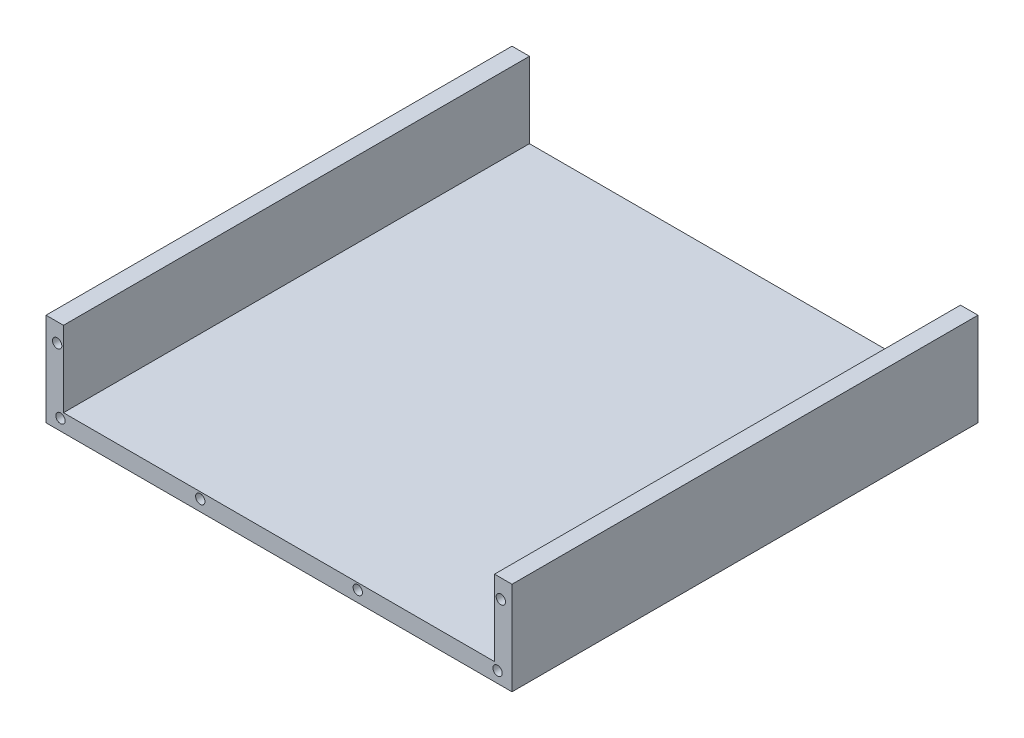
ISO-10303-21;
HEADER;
FILE_DESCRIPTION(('STEP AP214'),'2;1');
FILE_NAME('part.step','',(''),(''),'','','');
FILE_SCHEMA(('AUTOMOTIVE_DESIGN { 1 0 10303 214 1 1 1 1 }'));
ENDSEC;
DATA;
#1=APPLICATION_CONTEXT('core data for automotive mechanical design processes');
#2=APPLICATION_PROTOCOL_DEFINITION('international standard','automotive_design',2000,#1);
#3=PRODUCT_CONTEXT('',#1,'mechanical');
#4=PRODUCT('Part','Part','',(#3));
#5=PRODUCT_RELATED_PRODUCT_CATEGORY('part','',(#4));
#6=PRODUCT_DEFINITION_FORMATION('','',#4);
#7=PRODUCT_DEFINITION_CONTEXT('part definition',#1,'design');
#8=PRODUCT_DEFINITION('design','',#6,#7);
#9=PRODUCT_DEFINITION_SHAPE('','',#8);
#10=(LENGTH_UNIT() NAMED_UNIT(*) SI_UNIT(.MILLI.,.METRE.));
#11=(NAMED_UNIT(*) PLANE_ANGLE_UNIT() SI_UNIT($,.RADIAN.));
#12=(NAMED_UNIT(*) SI_UNIT($,.STERADIAN.) SOLID_ANGLE_UNIT());
#13=UNCERTAINTY_MEASURE_WITH_UNIT(LENGTH_MEASURE(1.E-05),#10,'distance_accuracy_value','');
#14=(GEOMETRIC_REPRESENTATION_CONTEXT(3) GLOBAL_UNCERTAINTY_ASSIGNED_CONTEXT((#13)) GLOBAL_UNIT_ASSIGNED_CONTEXT((#10,
#11,#12)) REPRESENTATION_CONTEXT('',''));
#15=CARTESIAN_POINT('',(0.,0.,0.));
#16=DIRECTION('',(0.,0.,1.));
#17=DIRECTION('',(1.,0.,0.));
#18=AXIS2_PLACEMENT_3D('',#15,#16,#17);
#19=CARTESIAN_POINT('',(0.,0.,63.5));
#20=DIRECTION('',(0.,0.,1.));
#21=DIRECTION('',(1.,0.,0.));
#22=AXIS2_PLACEMENT_3D('',#19,#20,#21);
#23=PLANE('',#22);
#24=CARTESIAN_POINT('',(59.563,-9.652,63.5));
#25=DIRECTION('',(0.,0.,-1.));
#26=DIRECTION('',(-1.,0.,0.));
#27=AXIS2_PLACEMENT_3D('',#24,#25,#26);
#28=CIRCLE('',#27,1.27);
#29=CARTESIAN_POINT('',(58.293,-9.652,63.5));
#30=VERTEX_POINT('',#29);
#31=EDGE_CURVE('E238',#30,#30,#28,.T.);
#32=ORIENTED_EDGE('',*,*,#31,.T.);
#33=EDGE_LOOP('',(#32));
#34=FACE_BOUND('',#33,.T.);
#35=CARTESIAN_POINT('',(-59.563,-9.652,63.5));
#36=DIRECTION('',(0.,0.,1.));
#37=DIRECTION('',(1.,0.,0.));
#38=AXIS2_PLACEMENT_3D('',#35,#36,#37);
#39=CIRCLE('',#38,1.27);
#40=CARTESIAN_POINT('',(-58.293,-9.652,63.5));
#41=VERTEX_POINT('',#40);
#42=EDGE_CURVE('E239',#41,#41,#39,.T.);
#43=ORIENTED_EDGE('',*,*,#42,.F.);
#44=EDGE_LOOP('',(#43));
#45=FACE_BOUND('',#44,.T.);
#46=CARTESIAN_POINT('',(21.463,-9.652,63.5));
#47=DIRECTION('',(0.,0.,1.));
#48=DIRECTION('',(1.,0.,0.));
#49=AXIS2_PLACEMENT_3D('',#46,#47,#48);
#50=CIRCLE('',#49,1.27);
#51=CARTESIAN_POINT('',(22.733,-9.652,63.5));
#52=VERTEX_POINT('',#51);
#53=EDGE_CURVE('E226',#52,#52,#50,.T.);
#54=ORIENTED_EDGE('',*,*,#53,.F.);
#55=EDGE_LOOP('',(#54));
#56=FACE_BOUND('',#55,.T.);
#57=DIRECTION('',(-1.,0.,0.));
#58=VECTOR('',#57,1.);
#59=CARTESIAN_POINT('',(-58.7375,12.7,63.5));
#60=LINE('',#59,#58);
#61=CARTESIAN_POINT('',(-58.7375,12.7,63.5));
#62=VERTEX_POINT('',#61);
#63=CARTESIAN_POINT('',(-63.5,12.7,63.5));
#64=VERTEX_POINT('',#63);
#65=EDGE_CURVE('E180',#62,#64,#60,.T.);
#66=ORIENTED_EDGE('',*,*,#65,.T.);
#67=DIRECTION('',(0.,-1.,0.));
#68=VECTOR('',#67,1.);
#69=CARTESIAN_POINT('',(-63.5,12.7,63.5));
#70=LINE('',#69,#68);
#71=CARTESIAN_POINT('',(-63.5,-12.7,63.5));
#72=VERTEX_POINT('',#71);
#73=EDGE_CURVE('E115',#64,#72,#70,.T.);
#74=ORIENTED_EDGE('',*,*,#73,.T.);
#75=DIRECTION('',(1.,0.,0.));
#76=VECTOR('',#75,1.);
#77=CARTESIAN_POINT('',(-63.5,-12.7,63.5));
#78=LINE('',#77,#76);
#79=CARTESIAN_POINT('',(63.5,-12.7,63.5));
#80=VERTEX_POINT('',#79);
#81=EDGE_CURVE('E202',#72,#80,#78,.T.);
#82=ORIENTED_EDGE('',*,*,#81,.T.);
#83=DIRECTION('',(0.,1.,0.));
#84=VECTOR('',#83,1.);
#85=CARTESIAN_POINT('',(63.5,-12.7,63.5));
#86=LINE('',#85,#84);
#87=CARTESIAN_POINT('',(63.5,12.7,63.5));
#88=VERTEX_POINT('',#87);
#89=EDGE_CURVE('E215',#80,#88,#86,.T.);
#90=ORIENTED_EDGE('',*,*,#89,.T.);
#91=DIRECTION('',(-1.,0.,0.));
#92=VECTOR('',#91,1.);
#93=CARTESIAN_POINT('',(63.5,12.7,63.5));
#94=LINE('',#93,#92);
#95=CARTESIAN_POINT('',(58.7375,12.7,63.5));
#96=VERTEX_POINT('',#95);
#97=EDGE_CURVE('E134',#88,#96,#94,.T.);
#98=ORIENTED_EDGE('',*,*,#97,.T.);
#99=DIRECTION('',(0.,-1.,0.));
#100=VECTOR('',#99,1.);
#101=CARTESIAN_POINT('',(58.7375,12.7,63.5));
#102=LINE('',#101,#100);
#103=CARTESIAN_POINT('',(58.7375,-7.93749999999999,63.5));
#104=VERTEX_POINT('',#103);
#105=EDGE_CURVE('E128',#96,#104,#102,.T.);
#106=ORIENTED_EDGE('',*,*,#105,.T.);
#107=DIRECTION('',(-1.,0.,0.));
#108=VECTOR('',#107,1.);
#109=CARTESIAN_POINT('',(58.7375,-7.93749999999999,63.5));
#110=LINE('',#109,#108);
#111=CARTESIAN_POINT('',(-58.7375,-7.9375,63.5));
#112=VERTEX_POINT('',#111);
#113=EDGE_CURVE('E132',#104,#112,#110,.T.);
#114=ORIENTED_EDGE('',*,*,#113,.T.);
#115=DIRECTION('',(0.,1.,0.));
#116=VECTOR('',#115,1.);
#117=CARTESIAN_POINT('',(-58.7375,-7.9375,63.5));
#118=LINE('',#117,#116);
#119=EDGE_CURVE('E72',#112,#62,#118,.T.);
#120=ORIENTED_EDGE('',*,*,#119,.T.);
#121=EDGE_LOOP('',(#66,#74,#82,#90,#98,#106,#114,#120));
#122=FACE_BOUND('',#121,.T.);
#123=CARTESIAN_POINT('',(-21.463,-9.652,63.5));
#124=DIRECTION('',(0.,0.,1.));
#125=DIRECTION('',(1.,0.,0.));
#126=AXIS2_PLACEMENT_3D('',#123,#124,#125);
#127=CIRCLE('',#126,1.27);
#128=CARTESIAN_POINT('',(-20.193,-9.652,63.5));
#129=VERTEX_POINT('',#128);
#130=EDGE_CURVE('E247',#129,#129,#127,.T.);
#131=ORIENTED_EDGE('',*,*,#130,.F.);
#132=EDGE_LOOP('',(#131));
#133=FACE_BOUND('',#132,.T.);
#134=CARTESIAN_POINT('',(-60.452,7.62,63.5));
#135=DIRECTION('',(0.,0.,1.));
#136=DIRECTION('',(1.,0.,0.));
#137=AXIS2_PLACEMENT_3D('',#134,#135,#136);
#138=CIRCLE('',#137,1.27);
#139=CARTESIAN_POINT('',(-59.182,7.62,63.5));
#140=VERTEX_POINT('',#139);
#141=EDGE_CURVE('E255',#140,#140,#138,.T.);
#142=ORIENTED_EDGE('',*,*,#141,.F.);
#143=EDGE_LOOP('',(#142));
#144=FACE_BOUND('',#143,.T.);
#145=CARTESIAN_POINT('',(60.452,7.62,63.5));
#146=DIRECTION('',(0.,0.,1.));
#147=DIRECTION('',(1.,0.,0.));
#148=AXIS2_PLACEMENT_3D('',#145,#146,#147);
#149=CIRCLE('',#148,1.26999999999999);
#150=CARTESIAN_POINT('',(61.722,7.62,63.5));
#151=VERTEX_POINT('',#150);
#152=EDGE_CURVE('E230',#151,#151,#149,.F.);
#153=ORIENTED_EDGE('',*,*,#152,.T.);
#154=EDGE_LOOP('',(#153));
#155=FACE_BOUND('',#154,.T.);
#156=ADVANCED_FACE('F54',(#34,#45,#56,#122,#133,#144,#155),#23,.T.);
#157=CARTESIAN_POINT('',(-58.7375,12.7,63.5));
#158=DIRECTION('',(0.,-1.,0.));
#159=DIRECTION('',(0.,0.,-1.));
#160=AXIS2_PLACEMENT_3D('',#157,#158,#159);
#161=PLANE('',#160);
#162=DIRECTION('',(-1.,0.,0.));
#163=VECTOR('',#162,1.);
#164=CARTESIAN_POINT('',(-58.7375,12.7,-63.5));
#165=LINE('',#164,#163);
#166=CARTESIAN_POINT('',(-58.7375,12.7,-63.5));
#167=VERTEX_POINT('',#166);
#168=CARTESIAN_POINT('',(-63.5,12.7,-63.5));
#169=VERTEX_POINT('',#168);
#170=EDGE_CURVE('E157',#167,#169,#165,.T.);
#171=ORIENTED_EDGE('',*,*,#170,.T.);
#172=DIRECTION('',(0.,0.,-1.));
#173=VECTOR('',#172,1.);
#174=CARTESIAN_POINT('',(-63.5,12.7,63.5));
#175=LINE('',#174,#173);
#176=EDGE_CURVE('E13',#64,#169,#175,.T.);
#177=ORIENTED_EDGE('',*,*,#176,.F.);
#178=ORIENTED_EDGE('',*,*,#65,.F.);
#179=DIRECTION('',(0.,0.,-1.));
#180=VECTOR('',#179,1.);
#181=CARTESIAN_POINT('',(-58.7375,12.7,63.5));
#182=LINE('',#181,#180);
#183=EDGE_CURVE('E153',#62,#167,#182,.T.);
#184=ORIENTED_EDGE('',*,*,#183,.T.);
#185=EDGE_LOOP('',(#171,#177,#178,#184));
#186=FACE_BOUND('',#185,.T.);
#187=ADVANCED_FACE('F56',(#186),#161,.F.);
#188=CARTESIAN_POINT('',(-63.5,12.7,63.5));
#189=DIRECTION('',(1.,0.,0.));
#190=DIRECTION('',(0.,0.,-1.));
#191=AXIS2_PLACEMENT_3D('',#188,#189,#190);
#192=PLANE('',#191);
#193=DIRECTION('',(0.,-1.,0.));
#194=VECTOR('',#193,1.);
#195=CARTESIAN_POINT('',(-63.5,12.7,-63.5));
#196=LINE('',#195,#194);
#197=CARTESIAN_POINT('',(-63.5,-12.7,-63.5));
#198=VERTEX_POINT('',#197);
#199=EDGE_CURVE('E161',#169,#198,#196,.T.);
#200=ORIENTED_EDGE('',*,*,#199,.T.);
#201=DIRECTION('',(0.,0.,-1.));
#202=VECTOR('',#201,1.);
#203=CARTESIAN_POINT('',(-63.5,-12.7,63.5));
#204=LINE('',#203,#202);
#205=EDGE_CURVE('E64',#72,#198,#204,.T.);
#206=ORIENTED_EDGE('',*,*,#205,.F.);
#207=ORIENTED_EDGE('',*,*,#73,.F.);
#208=ORIENTED_EDGE('',*,*,#176,.T.);
#209=EDGE_LOOP('',(#200,#206,#207,#208));
#210=FACE_BOUND('',#209,.T.);
#211=ADVANCED_FACE('F356',(#210),#192,.F.);
#212=CARTESIAN_POINT('',(-63.5,-12.7,63.5));
#213=DIRECTION('',(0.,1.,0.));
#214=DIRECTION('',(0.,0.,1.));
#215=AXIS2_PLACEMENT_3D('',#212,#213,#214);
#216=PLANE('',#215);
#217=DIRECTION('',(1.,0.,0.));
#218=VECTOR('',#217,1.);
#219=CARTESIAN_POINT('',(-63.5,-12.7,-63.5));
#220=LINE('',#219,#218);
#221=CARTESIAN_POINT('',(63.5,-12.7,-63.5));
#222=VERTEX_POINT('',#221);
#223=EDGE_CURVE('E165',#198,#222,#220,.T.);
#224=ORIENTED_EDGE('',*,*,#223,.T.);
#225=DIRECTION('',(0.,0.,-1.));
#226=VECTOR('',#225,1.);
#227=CARTESIAN_POINT('',(63.5,-12.7,63.5));
#228=LINE('',#227,#226);
#229=EDGE_CURVE('E191',#80,#222,#228,.T.);
#230=ORIENTED_EDGE('',*,*,#229,.F.);
#231=ORIENTED_EDGE('',*,*,#81,.F.);
#232=ORIENTED_EDGE('',*,*,#205,.T.);
#233=EDGE_LOOP('',(#224,#230,#231,#232));
#234=FACE_BOUND('',#233,.T.);
#235=ADVANCED_FACE('F200',(#234),#216,.F.);
#236=CARTESIAN_POINT('',(63.5,-12.7,63.5));
#237=DIRECTION('',(-1.,0.,0.));
#238=DIRECTION('',(0.,0.,1.));
#239=AXIS2_PLACEMENT_3D('',#236,#237,#238);
#240=PLANE('',#239);
#241=DIRECTION('',(0.,1.,0.));
#242=VECTOR('',#241,1.);
#243=CARTESIAN_POINT('',(63.5,-12.7,-63.5));
#244=LINE('',#243,#242);
#245=CARTESIAN_POINT('',(63.5,12.7,-63.5));
#246=VERTEX_POINT('',#245);
#247=EDGE_CURVE('E168',#222,#246,#244,.T.);
#248=ORIENTED_EDGE('',*,*,#247,.T.);
#249=DIRECTION('',(0.,0.,-1.));
#250=VECTOR('',#249,1.);
#251=CARTESIAN_POINT('',(63.5,12.7,63.5));
#252=LINE('',#251,#250);
#253=EDGE_CURVE('E187',#88,#246,#252,.T.);
#254=ORIENTED_EDGE('',*,*,#253,.F.);
#255=ORIENTED_EDGE('',*,*,#89,.F.);
#256=ORIENTED_EDGE('',*,*,#229,.T.);
#257=EDGE_LOOP('',(#248,#254,#255,#256));
#258=FACE_BOUND('',#257,.T.);
#259=ADVANCED_FACE('F210',(#258),#240,.F.);
#260=CARTESIAN_POINT('',(63.5,12.7,63.5));
#261=DIRECTION('',(0.,-1.,0.));
#262=DIRECTION('',(0.,0.,-1.));
#263=AXIS2_PLACEMENT_3D('',#260,#261,#262);
#264=PLANE('',#263);
#265=DIRECTION('',(-1.,0.,0.));
#266=VECTOR('',#265,1.);
#267=CARTESIAN_POINT('',(63.5,12.7,-63.5));
#268=LINE('',#267,#266);
#269=CARTESIAN_POINT('',(58.7375,12.7,-63.5));
#270=VERTEX_POINT('',#269);
#271=EDGE_CURVE('E171',#246,#270,#268,.T.);
#272=ORIENTED_EDGE('',*,*,#271,.T.);
#273=DIRECTION('',(0.,0.,-1.));
#274=VECTOR('',#273,1.);
#275=CARTESIAN_POINT('',(58.7375,12.7,63.5));
#276=LINE('',#275,#274);
#277=EDGE_CURVE('E145',#96,#270,#276,.T.);
#278=ORIENTED_EDGE('',*,*,#277,.F.);
#279=ORIENTED_EDGE('',*,*,#97,.F.);
#280=ORIENTED_EDGE('',*,*,#253,.T.);
#281=EDGE_LOOP('',(#272,#278,#279,#280));
#282=FACE_BOUND('',#281,.T.);
#283=ADVANCED_FACE('F213',(#282),#264,.F.);
#284=CARTESIAN_POINT('',(58.7375,12.7,63.5));
#285=DIRECTION('',(1.,0.,0.));
#286=DIRECTION('',(0.,0.,-1.));
#287=AXIS2_PLACEMENT_3D('',#284,#285,#286);
#288=PLANE('',#287);
#289=DIRECTION('',(0.,-1.,0.));
#290=VECTOR('',#289,1.);
#291=CARTESIAN_POINT('',(58.7375,12.7,-63.5));
#292=LINE('',#291,#290);
#293=CARTESIAN_POINT('',(58.7375,-7.93749999999999,-63.5));
#294=VERTEX_POINT('',#293);
#295=EDGE_CURVE('E143',#270,#294,#292,.T.);
#296=ORIENTED_EDGE('',*,*,#295,.T.);
#297=DIRECTION('',(0.,0.,-1.));
#298=VECTOR('',#297,1.);
#299=CARTESIAN_POINT('',(58.7375,-7.93749999999999,63.5));
#300=LINE('',#299,#298);
#301=EDGE_CURVE('E140',#104,#294,#300,.T.);
#302=ORIENTED_EDGE('',*,*,#301,.F.);
#303=ORIENTED_EDGE('',*,*,#105,.F.);
#304=ORIENTED_EDGE('',*,*,#277,.T.);
#305=EDGE_LOOP('',(#296,#302,#303,#304));
#306=FACE_BOUND('',#305,.T.);
#307=ADVANCED_FACE('F141',(#306),#288,.F.);
#308=CARTESIAN_POINT('',(58.7375,-7.93749999999999,63.5));
#309=DIRECTION('',(0.,-1.,0.));
#310=DIRECTION('',(1.,0.,0.));
#311=AXIS2_PLACEMENT_3D('',#308,#309,#310);
#312=PLANE('',#311);
#313=DIRECTION('',(-1.,0.,0.));
#314=VECTOR('',#313,1.);
#315=CARTESIAN_POINT('',(58.7375,-7.93749999999999,-63.5));
#316=LINE('',#315,#314);
#317=CARTESIAN_POINT('',(-58.7375,-7.9375,-63.5));
#318=VERTEX_POINT('',#317);
#319=EDGE_CURVE('E101',#294,#318,#316,.T.);
#320=ORIENTED_EDGE('',*,*,#319,.T.);
#321=DIRECTION('',(0.,0.,-1.));
#322=VECTOR('',#321,1.);
#323=CARTESIAN_POINT('',(-58.7375,-7.9375,63.5));
#324=LINE('',#323,#322);
#325=EDGE_CURVE('E146',#112,#318,#324,.T.);
#326=ORIENTED_EDGE('',*,*,#325,.F.);
#327=ORIENTED_EDGE('',*,*,#113,.F.);
#328=ORIENTED_EDGE('',*,*,#301,.T.);
#329=EDGE_LOOP('',(#320,#326,#327,#328));
#330=FACE_BOUND('',#329,.T.);
#331=ADVANCED_FACE('F148',(#330),#312,.F.);
#332=CARTESIAN_POINT('',(-58.7375,-7.9375,63.5));
#333=DIRECTION('',(-1.,0.,0.));
#334=DIRECTION('',(0.,0.,1.));
#335=AXIS2_PLACEMENT_3D('',#332,#333,#334);
#336=PLANE('',#335);
#337=DIRECTION('',(0.,1.,0.));
#338=VECTOR('',#337,1.);
#339=CARTESIAN_POINT('',(-58.7375,-7.9375,-63.5));
#340=LINE('',#339,#338);
#341=EDGE_CURVE('E107',#318,#167,#340,.T.);
#342=ORIENTED_EDGE('',*,*,#341,.T.);
#343=ORIENTED_EDGE('',*,*,#183,.F.);
#344=ORIENTED_EDGE('',*,*,#119,.F.);
#345=ORIENTED_EDGE('',*,*,#325,.T.);
#346=EDGE_LOOP('',(#342,#343,#344,#345));
#347=FACE_BOUND('',#346,.T.);
#348=ADVANCED_FACE('F328',(#347),#336,.F.);
#349=CARTESIAN_POINT('',(0.,0.,-63.5));
#350=DIRECTION('',(0.,0.,1.));
#351=DIRECTION('',(1.,0.,0.));
#352=AXIS2_PLACEMENT_3D('',#349,#350,#351);
#353=PLANE('',#352);
#354=CARTESIAN_POINT('',(60.452,7.61999999999999,-63.5));
#355=DIRECTION('',(0.,0.,-1.));
#356=DIRECTION('',(-1.,0.,0.));
#357=AXIS2_PLACEMENT_3D('',#354,#355,#356);
#358=CIRCLE('',#357,1.27);
#359=CARTESIAN_POINT('',(59.182,7.61999999999999,-63.5));
#360=VERTEX_POINT('',#359);
#361=EDGE_CURVE('E278',#360,#360,#358,.T.);
#362=ORIENTED_EDGE('',*,*,#361,.F.);
#363=EDGE_LOOP('',(#362));
#364=FACE_BOUND('',#363,.T.);
#365=CARTESIAN_POINT('',(21.463,-9.652,-63.5));
#366=DIRECTION('',(0.,0.,-1.));
#367=DIRECTION('',(-1.,0.,0.));
#368=AXIS2_PLACEMENT_3D('',#365,#366,#367);
#369=CIRCLE('',#368,1.27);
#370=CARTESIAN_POINT('',(20.193,-9.652,-63.5));
#371=VERTEX_POINT('',#370);
#372=EDGE_CURVE('E303',#371,#371,#369,.T.);
#373=ORIENTED_EDGE('',*,*,#372,.F.);
#374=EDGE_LOOP('',(#373));
#375=FACE_BOUND('',#374,.T.);
#376=CARTESIAN_POINT('',(-21.463,-9.652,-63.5));
#377=DIRECTION('',(0.,0.,-1.));
#378=DIRECTION('',(1.,0.,0.));
#379=AXIS2_PLACEMENT_3D('',#376,#377,#378);
#380=CIRCLE('',#379,1.27);
#381=CARTESIAN_POINT('',(-20.193,-9.652,-63.5));
#382=VERTEX_POINT('',#381);
#383=EDGE_CURVE('E295',#382,#382,#380,.T.);
#384=ORIENTED_EDGE('',*,*,#383,.F.);
#385=EDGE_LOOP('',(#384));
#386=FACE_BOUND('',#385,.T.);
#387=CARTESIAN_POINT('',(-60.452,7.61999999999999,-63.5));
#388=DIRECTION('',(0.,0.,-1.));
#389=DIRECTION('',(1.,0.,0.));
#390=AXIS2_PLACEMENT_3D('',#387,#388,#389);
#391=CIRCLE('',#390,1.27);
#392=CARTESIAN_POINT('',(-59.182,7.61999999999999,-63.5));
#393=VERTEX_POINT('',#392);
#394=EDGE_CURVE('E286',#393,#393,#391,.T.);
#395=ORIENTED_EDGE('',*,*,#394,.F.);
#396=EDGE_LOOP('',(#395));
#397=FACE_BOUND('',#396,.T.);
#398=CARTESIAN_POINT('',(-59.563,-9.652,-63.5));
#399=DIRECTION('',(0.,0.,-1.));
#400=DIRECTION('',(1.,0.,0.));
#401=AXIS2_PLACEMENT_3D('',#398,#399,#400);
#402=CIRCLE('',#401,1.27);
#403=CARTESIAN_POINT('',(-58.293,-9.652,-63.5));
#404=VERTEX_POINT('',#403);
#405=EDGE_CURVE('E287',#404,#404,#402,.T.);
#406=ORIENTED_EDGE('',*,*,#405,.F.);
#407=EDGE_LOOP('',(#406));
#408=FACE_BOUND('',#407,.T.);
#409=CARTESIAN_POINT('',(59.563,-9.652,-63.5));
#410=DIRECTION('',(0.,0.,-1.));
#411=DIRECTION('',(-1.,0.,0.));
#412=AXIS2_PLACEMENT_3D('',#409,#410,#411);
#413=CIRCLE('',#412,1.27);
#414=CARTESIAN_POINT('',(58.293,-9.652,-63.5));
#415=VERTEX_POINT('',#414);
#416=EDGE_CURVE('E274',#415,#415,#413,.T.);
#417=ORIENTED_EDGE('',*,*,#416,.F.);
#418=EDGE_LOOP('',(#417));
#419=FACE_BOUND('',#418,.T.);
#420=ORIENTED_EDGE('',*,*,#170,.F.);
#421=ORIENTED_EDGE('',*,*,#341,.F.);
#422=ORIENTED_EDGE('',*,*,#319,.F.);
#423=ORIENTED_EDGE('',*,*,#295,.F.);
#424=ORIENTED_EDGE('',*,*,#271,.F.);
#425=ORIENTED_EDGE('',*,*,#247,.F.);
#426=ORIENTED_EDGE('',*,*,#223,.F.);
#427=ORIENTED_EDGE('',*,*,#199,.F.);
#428=EDGE_LOOP('',(#420,#421,#422,#423,#424,#425,#426,#427));
#429=FACE_BOUND('',#428,.T.);
#430=ADVANCED_FACE('F206',(#364,#375,#386,#397,#408,#419,#429),#353,.F.);
#431=CARTESIAN_POINT('',(21.463,-9.652,60.96));
#432=DIRECTION('',(0.,0.,1.));
#433=DIRECTION('',(1.,0.,0.));
#434=AXIS2_PLACEMENT_3D('',#431,#432,#433);
#435=CYLINDRICAL_SURFACE('',#434,1.27);
#436=CARTESIAN_POINT('',(21.463,-9.652,60.96));
#437=DIRECTION('',(0.,0.,1.));
#438=DIRECTION('',(1.,0.,0.));
#439=AXIS2_PLACEMENT_3D('',#436,#437,#438);
#440=CIRCLE('',#439,1.27);
#441=CARTESIAN_POINT('',(22.733,-9.652,60.96));
#442=VERTEX_POINT('',#441);
#443=EDGE_CURVE('E162',#442,#442,#440,.T.);
#444=ORIENTED_EDGE('',*,*,#443,.F.);
#445=EDGE_LOOP('',(#444));
#446=FACE_BOUND('',#445,.T.);
#447=ORIENTED_EDGE('',*,*,#53,.T.);
#448=EDGE_LOOP('',(#447));
#449=FACE_BOUND('',#448,.T.);
#450=ADVANCED_FACE('F327',(#446,#449),#435,.F.);
#451=CARTESIAN_POINT('',(0.,0.,60.96));
#452=DIRECTION('',(0.,0.,1.));
#453=DIRECTION('',(1.,0.,0.));
#454=AXIS2_PLACEMENT_3D('',#451,#452,#453);
#455=PLANE('',#454);
#456=ORIENTED_EDGE('',*,*,#443,.T.);
#457=EDGE_LOOP('',(#456));
#458=FACE_BOUND('',#457,.T.);
#459=ADVANCED_FACE('F415',(#458),#455,.T.);
#460=CARTESIAN_POINT('',(-59.563,-9.652,60.96));
#461=DIRECTION('',(0.,0.,1.));
#462=DIRECTION('',(1.,0.,0.));
#463=AXIS2_PLACEMENT_3D('',#460,#461,#462);
#464=CYLINDRICAL_SURFACE('',#463,1.27);
#465=CARTESIAN_POINT('',(-59.563,-9.652,60.96));
#466=DIRECTION('',(0.,0.,1.));
#467=DIRECTION('',(1.,0.,0.));
#468=AXIS2_PLACEMENT_3D('',#465,#466,#467);
#469=CIRCLE('',#468,1.27);
#470=CARTESIAN_POINT('',(-58.293,-9.652,60.96));
#471=VERTEX_POINT('',#470);
#472=EDGE_CURVE('E266',#471,#471,#469,.T.);
#473=ORIENTED_EDGE('',*,*,#472,.F.);
#474=EDGE_LOOP('',(#473));
#475=FACE_BOUND('',#474,.T.);
#476=ORIENTED_EDGE('',*,*,#42,.T.);
#477=EDGE_LOOP('',(#476));
#478=FACE_BOUND('',#477,.T.);
#479=ADVANCED_FACE('F422',(#475,#478),#464,.F.);
#480=CARTESIAN_POINT('',(-59.563,-9.652,60.96));
#481=DIRECTION('',(0.,0.,1.));
#482=DIRECTION('',(1.,0.,0.));
#483=AXIS2_PLACEMENT_3D('',#480,#481,#482);
#484=PLANE('',#483);
#485=ORIENTED_EDGE('',*,*,#472,.T.);
#486=EDGE_LOOP('',(#485));
#487=FACE_BOUND('',#486,.T.);
#488=ADVANCED_FACE('F429',(#487),#484,.T.);
#489=CARTESIAN_POINT('',(59.563,-9.652,60.96));
#490=DIRECTION('',(0.,0.,1.));
#491=DIRECTION('',(1.,0.,0.));
#492=AXIS2_PLACEMENT_3D('',#489,#490,#491);
#493=CYLINDRICAL_SURFACE('',#492,1.27);
#494=CARTESIAN_POINT('',(59.563,-9.652,60.96));
#495=DIRECTION('',(0.,0.,-1.));
#496=DIRECTION('',(-1.,0.,0.));
#497=AXIS2_PLACEMENT_3D('',#494,#495,#496);
#498=CIRCLE('',#497,1.27);
#499=CARTESIAN_POINT('',(58.293,-9.652,60.96));
#500=VERTEX_POINT('',#499);
#501=EDGE_CURVE('E234',#500,#500,#498,.T.);
#502=ORIENTED_EDGE('',*,*,#501,.T.);
#503=EDGE_LOOP('',(#502));
#504=FACE_BOUND('',#503,.T.);
#505=ORIENTED_EDGE('',*,*,#31,.F.);
#506=EDGE_LOOP('',(#505));
#507=FACE_BOUND('',#506,.T.);
#508=ADVANCED_FACE('F436',(#504,#507),#493,.F.);
#509=CARTESIAN_POINT('',(59.563,-9.652,60.96));
#510=DIRECTION('',(0.,0.,-1.));
#511=DIRECTION('',(-1.,0.,0.));
#512=AXIS2_PLACEMENT_3D('',#509,#510,#511);
#513=PLANE('',#512);
#514=ORIENTED_EDGE('',*,*,#501,.F.);
#515=EDGE_LOOP('',(#514));
#516=FACE_BOUND('',#515,.T.);
#517=ADVANCED_FACE('F444',(#516),#513,.F.);
#518=CARTESIAN_POINT('',(-21.463,-9.652,60.96));
#519=DIRECTION('',(0.,0.,1.));
#520=DIRECTION('',(1.,0.,0.));
#521=AXIS2_PLACEMENT_3D('',#518,#519,#520);
#522=CYLINDRICAL_SURFACE('',#521,1.27);
#523=CARTESIAN_POINT('',(-21.463,-9.652,60.96));
#524=DIRECTION('',(0.,0.,1.));
#525=DIRECTION('',(1.,0.,0.));
#526=AXIS2_PLACEMENT_3D('',#523,#524,#525);
#527=CIRCLE('',#526,1.27);
#528=CARTESIAN_POINT('',(-20.193,-9.652,60.96));
#529=VERTEX_POINT('',#528);
#530=EDGE_CURVE('E243',#529,#529,#527,.T.);
#531=ORIENTED_EDGE('',*,*,#530,.F.);
#532=EDGE_LOOP('',(#531));
#533=FACE_BOUND('',#532,.T.);
#534=ORIENTED_EDGE('',*,*,#130,.T.);
#535=EDGE_LOOP('',(#534));
#536=FACE_BOUND('',#535,.T.);
#537=ADVANCED_FACE('F452',(#533,#536),#522,.F.);
#538=CARTESIAN_POINT('',(-21.463,-9.652,60.96));
#539=DIRECTION('',(0.,0.,1.));
#540=DIRECTION('',(1.,0.,0.));
#541=AXIS2_PLACEMENT_3D('',#538,#539,#540);
#542=PLANE('',#541);
#543=ORIENTED_EDGE('',*,*,#530,.T.);
#544=EDGE_LOOP('',(#543));
#545=FACE_BOUND('',#544,.T.);
#546=ADVANCED_FACE('F460',(#545),#542,.T.);
#547=CARTESIAN_POINT('',(-60.452,7.62,60.96));
#548=DIRECTION('',(0.,0.,1.));
#549=DIRECTION('',(1.,0.,0.));
#550=AXIS2_PLACEMENT_3D('',#547,#548,#549);
#551=CYLINDRICAL_SURFACE('',#550,1.27);
#552=CARTESIAN_POINT('',(-60.452,7.62,60.96));
#553=DIRECTION('',(0.,0.,1.));
#554=DIRECTION('',(1.,0.,0.));
#555=AXIS2_PLACEMENT_3D('',#552,#553,#554);
#556=CIRCLE('',#555,1.27);
#557=CARTESIAN_POINT('',(-59.182,7.62,60.96));
#558=VERTEX_POINT('',#557);
#559=EDGE_CURVE('E251',#558,#558,#556,.T.);
#560=ORIENTED_EDGE('',*,*,#559,.F.);
#561=EDGE_LOOP('',(#560));
#562=FACE_BOUND('',#561,.T.);
#563=ORIENTED_EDGE('',*,*,#141,.T.);
#564=EDGE_LOOP('',(#563));
#565=FACE_BOUND('',#564,.T.);
#566=ADVANCED_FACE('F468',(#562,#565),#551,.F.);
#567=CARTESIAN_POINT('',(-60.452,7.62,60.96));
#568=DIRECTION('',(0.,0.,1.));
#569=DIRECTION('',(1.,0.,0.));
#570=AXIS2_PLACEMENT_3D('',#567,#568,#569);
#571=PLANE('',#570);
#572=ORIENTED_EDGE('',*,*,#559,.T.);
#573=EDGE_LOOP('',(#572));
#574=FACE_BOUND('',#573,.T.);
#575=ADVANCED_FACE('F476',(#574),#571,.T.);
#576=CARTESIAN_POINT('',(60.452,7.62,60.96));
#577=DIRECTION('',(0.,0.,1.));
#578=DIRECTION('',(1.,0.,0.));
#579=AXIS2_PLACEMENT_3D('',#576,#577,#578);
#580=CYLINDRICAL_SURFACE('',#579,1.26999999999999);
#581=CARTESIAN_POINT('',(60.452,7.62,60.96));
#582=DIRECTION('',(0.,0.,1.));
#583=DIRECTION('',(1.,0.,0.));
#584=AXIS2_PLACEMENT_3D('',#581,#582,#583);
#585=CIRCLE('',#584,1.26999999999999);
#586=CARTESIAN_POINT('',(61.722,7.62,60.96));
#587=VERTEX_POINT('',#586);
#588=EDGE_CURVE('E259',#587,#587,#585,.F.);
#589=ORIENTED_EDGE('',*,*,#588,.T.);
#590=EDGE_LOOP('',(#589));
#591=FACE_BOUND('',#590,.T.);
#592=ORIENTED_EDGE('',*,*,#152,.F.);
#593=EDGE_LOOP('',(#592));
#594=FACE_BOUND('',#593,.T.);
#595=ADVANCED_FACE('F345',(#591,#594),#580,.F.);
#596=CARTESIAN_POINT('',(0.,0.,60.96));
#597=DIRECTION('',(0.,0.,1.));
#598=DIRECTION('',(1.,0.,0.));
#599=AXIS2_PLACEMENT_3D('',#596,#597,#598);
#600=PLANE('',#599);
#601=ORIENTED_EDGE('',*,*,#588,.F.);
#602=EDGE_LOOP('',(#601));
#603=FACE_BOUND('',#602,.T.);
#604=ADVANCED_FACE('F336',(#603),#600,.T.);
#605=CARTESIAN_POINT('',(59.563,-9.652,-60.96));
#606=DIRECTION('',(0.,0.,-1.));
#607=DIRECTION('',(-1.,0.,0.));
#608=AXIS2_PLACEMENT_3D('',#605,#606,#607);
#609=CYLINDRICAL_SURFACE('',#608,1.27);
#610=CARTESIAN_POINT('',(59.563,-9.652,-60.96));
#611=DIRECTION('',(0.,0.,-1.));
#612=DIRECTION('',(-1.,0.,0.));
#613=AXIS2_PLACEMENT_3D('',#610,#611,#612);
#614=CIRCLE('',#613,1.27);
#615=CARTESIAN_POINT('',(58.293,-9.652,-60.96));
#616=VERTEX_POINT('',#615);
#617=EDGE_CURVE('E270',#616,#616,#614,.T.);
#618=ORIENTED_EDGE('',*,*,#617,.F.);
#619=EDGE_LOOP('',(#618));
#620=FACE_BOUND('',#619,.T.);
#621=ORIENTED_EDGE('',*,*,#416,.T.);
#622=EDGE_LOOP('',(#621));
#623=FACE_BOUND('',#622,.T.);
#624=ADVANCED_FACE('F333',(#620,#623),#609,.F.);
#625=CARTESIAN_POINT('',(59.563,-9.652,-60.96));
#626=DIRECTION('',(0.,0.,-1.));
#627=DIRECTION('',(-1.,0.,0.));
#628=AXIS2_PLACEMENT_3D('',#625,#626,#627);
#629=PLANE('',#628);
#630=ORIENTED_EDGE('',*,*,#617,.T.);
#631=EDGE_LOOP('',(#630));
#632=FACE_BOUND('',#631,.T.);
#633=ADVANCED_FACE('F335',(#632),#629,.T.);
#634=CARTESIAN_POINT('',(-59.563,-9.652,-60.96));
#635=DIRECTION('',(0.,0.,-1.));
#636=DIRECTION('',(-1.,0.,0.));
#637=AXIS2_PLACEMENT_3D('',#634,#635,#636);
#638=CYLINDRICAL_SURFACE('',#637,1.27);
#639=CARTESIAN_POINT('',(-59.563,-9.652,-60.96));
#640=DIRECTION('',(0.,0.,-1.));
#641=DIRECTION('',(1.,0.,0.));
#642=AXIS2_PLACEMENT_3D('',#639,#640,#641);
#643=CIRCLE('',#642,1.27);
#644=CARTESIAN_POINT('',(-58.293,-9.652,-60.96));
#645=VERTEX_POINT('',#644);
#646=EDGE_CURVE('E314',#645,#645,#643,.T.);
#647=ORIENTED_EDGE('',*,*,#646,.F.);
#648=EDGE_LOOP('',(#647));
#649=FACE_BOUND('',#648,.T.);
#650=ORIENTED_EDGE('',*,*,#405,.T.);
#651=EDGE_LOOP('',(#650));
#652=FACE_BOUND('',#651,.T.);
#653=ADVANCED_FACE('F323',(#649,#652),#638,.F.);
#654=CARTESIAN_POINT('',(-59.563,-9.652,-60.96));
#655=DIRECTION('',(0.,0.,1.));
#656=DIRECTION('',(1.,0.,0.));
#657=AXIS2_PLACEMENT_3D('',#654,#655,#656);
#658=PLANE('',#657);
#659=ORIENTED_EDGE('',*,*,#646,.T.);
#660=EDGE_LOOP('',(#659));
#661=FACE_BOUND('',#660,.T.);
#662=ADVANCED_FACE('F524',(#661),#658,.F.);
#663=CARTESIAN_POINT('',(-60.452,7.61999999999999,-60.96));
#664=DIRECTION('',(0.,0.,-1.));
#665=DIRECTION('',(-1.,0.,0.));
#666=AXIS2_PLACEMENT_3D('',#663,#664,#665);
#667=CYLINDRICAL_SURFACE('',#666,1.27);
#668=CARTESIAN_POINT('',(-60.452,7.61999999999999,-60.96));
#669=DIRECTION('',(0.,0.,-1.));
#670=DIRECTION('',(1.,0.,0.));
#671=AXIS2_PLACEMENT_3D('',#668,#669,#670);
#672=CIRCLE('',#671,1.27);
#673=CARTESIAN_POINT('',(-59.182,7.61999999999999,-60.96));
#674=VERTEX_POINT('',#673);
#675=EDGE_CURVE('E282',#674,#674,#672,.T.);
#676=ORIENTED_EDGE('',*,*,#675,.F.);
#677=EDGE_LOOP('',(#676));
#678=FACE_BOUND('',#677,.T.);
#679=ORIENTED_EDGE('',*,*,#394,.T.);
#680=EDGE_LOOP('',(#679));
#681=FACE_BOUND('',#680,.T.);
#682=ADVANCED_FACE('F535',(#678,#681),#667,.F.);
#683=CARTESIAN_POINT('',(-60.452,7.61999999999999,-60.96));
#684=DIRECTION('',(0.,0.,1.));
#685=DIRECTION('',(1.,0.,0.));
#686=AXIS2_PLACEMENT_3D('',#683,#684,#685);
#687=PLANE('',#686);
#688=ORIENTED_EDGE('',*,*,#675,.T.);
#689=EDGE_LOOP('',(#688));
#690=FACE_BOUND('',#689,.T.);
#691=ADVANCED_FACE('F546',(#690),#687,.F.);
#692=CARTESIAN_POINT('',(-21.463,-9.652,-60.96));
#693=DIRECTION('',(0.,0.,-1.));
#694=DIRECTION('',(-1.,0.,0.));
#695=AXIS2_PLACEMENT_3D('',#692,#693,#694);
#696=CYLINDRICAL_SURFACE('',#695,1.27);
#697=CARTESIAN_POINT('',(-21.463,-9.652,-60.96));
#698=DIRECTION('',(0.,0.,-1.));
#699=DIRECTION('',(1.,0.,0.));
#700=AXIS2_PLACEMENT_3D('',#697,#698,#699);
#701=CIRCLE('',#700,1.27);
#702=CARTESIAN_POINT('',(-20.193,-9.652,-60.96));
#703=VERTEX_POINT('',#702);
#704=EDGE_CURVE('E291',#703,#703,#701,.T.);
#705=ORIENTED_EDGE('',*,*,#704,.F.);
#706=EDGE_LOOP('',(#705));
#707=FACE_BOUND('',#706,.T.);
#708=ORIENTED_EDGE('',*,*,#383,.T.);
#709=EDGE_LOOP('',(#708));
#710=FACE_BOUND('',#709,.T.);
#711=ADVANCED_FACE('F557',(#707,#710),#696,.F.);
#712=CARTESIAN_POINT('',(-21.463,-9.652,-60.96));
#713=DIRECTION('',(0.,0.,1.));
#714=DIRECTION('',(1.,0.,0.));
#715=AXIS2_PLACEMENT_3D('',#712,#713,#714);
#716=PLANE('',#715);
#717=ORIENTED_EDGE('',*,*,#704,.T.);
#718=EDGE_LOOP('',(#717));
#719=FACE_BOUND('',#718,.T.);
#720=ADVANCED_FACE('F568',(#719),#716,.F.);
#721=CARTESIAN_POINT('',(21.463,-9.652,-60.96));
#722=DIRECTION('',(0.,0.,-1.));
#723=DIRECTION('',(-1.,0.,0.));
#724=AXIS2_PLACEMENT_3D('',#721,#722,#723);
#725=CYLINDRICAL_SURFACE('',#724,1.27);
#726=CARTESIAN_POINT('',(21.463,-9.652,-60.96));
#727=DIRECTION('',(0.,0.,-1.));
#728=DIRECTION('',(-1.,0.,0.));
#729=AXIS2_PLACEMENT_3D('',#726,#727,#728);
#730=CIRCLE('',#729,1.27);
#731=CARTESIAN_POINT('',(20.193,-9.652,-60.96));
#732=VERTEX_POINT('',#731);
#733=EDGE_CURVE('E299',#732,#732,#730,.T.);
#734=ORIENTED_EDGE('',*,*,#733,.F.);
#735=EDGE_LOOP('',(#734));
#736=FACE_BOUND('',#735,.T.);
#737=ORIENTED_EDGE('',*,*,#372,.T.);
#738=EDGE_LOOP('',(#737));
#739=FACE_BOUND('',#738,.T.);
#740=ADVANCED_FACE('F579',(#736,#739),#725,.F.);
#741=CARTESIAN_POINT('',(21.463,-9.652,-60.96));
#742=DIRECTION('',(0.,0.,-1.));
#743=DIRECTION('',(-1.,0.,0.));
#744=AXIS2_PLACEMENT_3D('',#741,#742,#743);
#745=PLANE('',#744);
#746=ORIENTED_EDGE('',*,*,#733,.T.);
#747=EDGE_LOOP('',(#746));
#748=FACE_BOUND('',#747,.T.);
#749=ADVANCED_FACE('F590',(#748),#745,.T.);
#750=CARTESIAN_POINT('',(60.452,7.61999999999999,-60.96));
#751=DIRECTION('',(0.,0.,-1.));
#752=DIRECTION('',(-1.,0.,0.));
#753=AXIS2_PLACEMENT_3D('',#750,#751,#752);
#754=CYLINDRICAL_SURFACE('',#753,1.27);
#755=CARTESIAN_POINT('',(60.452,7.61999999999999,-60.96));
#756=DIRECTION('',(0.,0.,-1.));
#757=DIRECTION('',(-1.,0.,0.));
#758=AXIS2_PLACEMENT_3D('',#755,#756,#757);
#759=CIRCLE('',#758,1.27);
#760=CARTESIAN_POINT('',(59.182,7.61999999999999,-60.96));
#761=VERTEX_POINT('',#760);
#762=EDGE_CURVE('E307',#761,#761,#759,.T.);
#763=ORIENTED_EDGE('',*,*,#762,.F.);
#764=EDGE_LOOP('',(#763));
#765=FACE_BOUND('',#764,.T.);
#766=ORIENTED_EDGE('',*,*,#361,.T.);
#767=EDGE_LOOP('',(#766));
#768=FACE_BOUND('',#767,.T.);
#769=ADVANCED_FACE('F601',(#765,#768),#754,.F.);
#770=CARTESIAN_POINT('',(60.452,7.61999999999999,-60.96));
#771=DIRECTION('',(0.,0.,-1.));
#772=DIRECTION('',(-1.,0.,0.));
#773=AXIS2_PLACEMENT_3D('',#770,#771,#772);
#774=PLANE('',#773);
#775=ORIENTED_EDGE('',*,*,#762,.T.);
#776=EDGE_LOOP('',(#775));
#777=FACE_BOUND('',#776,.T.);
#778=ADVANCED_FACE('F612',(#777),#774,.T.);
#779=CLOSED_SHELL('',(#156,#187,#211,#235,#259,#283,#307,#331,#348,#430,#450,#459,#479,#488,
#508,#517,#537,#546,#566,#575,#595,#604,#624,#633,#653,#662,#682,#691,#711,#720,#740,#749,#769,#778));
#780=MANIFOLD_SOLID_BREP('B2',#779);
#781=ADVANCED_BREP_SHAPE_REPRESENTATION('',(#18,#780),#14);
#782=SHAPE_DEFINITION_REPRESENTATION(#9,#781);
ENDSEC;
END-ISO-10303-21;
